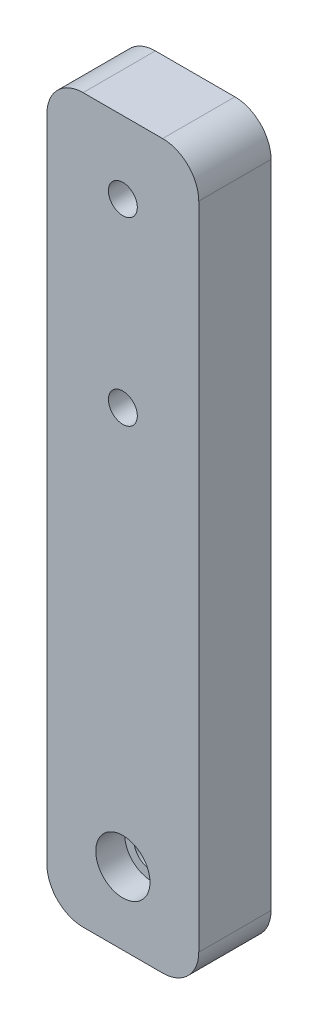
ISO-10303-21;
HEADER;
FILE_DESCRIPTION(('STEP AP214'),'2;1');
FILE_NAME('part.step','',(''),(''),'','','');
FILE_SCHEMA(('AUTOMOTIVE_DESIGN { 1 0 10303 214 1 1 1 1 }'));
ENDSEC;
DATA;
#1=APPLICATION_CONTEXT('core data for automotive mechanical design processes');
#2=APPLICATION_PROTOCOL_DEFINITION('international standard','automotive_design',2000,#1);
#3=PRODUCT_CONTEXT('',#1,'mechanical');
#4=PRODUCT('Part','Part','',(#3));
#5=PRODUCT_RELATED_PRODUCT_CATEGORY('part','',(#4));
#6=PRODUCT_DEFINITION_FORMATION('','',#4);
#7=PRODUCT_DEFINITION_CONTEXT('part definition',#1,'design');
#8=PRODUCT_DEFINITION('design','',#6,#7);
#9=PRODUCT_DEFINITION_SHAPE('','',#8);
#10=(LENGTH_UNIT() NAMED_UNIT(*) SI_UNIT(.MILLI.,.METRE.));
#11=(NAMED_UNIT(*) PLANE_ANGLE_UNIT() SI_UNIT($,.RADIAN.));
#12=(NAMED_UNIT(*) SI_UNIT($,.STERADIAN.) SOLID_ANGLE_UNIT());
#13=UNCERTAINTY_MEASURE_WITH_UNIT(LENGTH_MEASURE(1.E-05),#10,'distance_accuracy_value','');
#14=(GEOMETRIC_REPRESENTATION_CONTEXT(3) GLOBAL_UNCERTAINTY_ASSIGNED_CONTEXT((#13)) GLOBAL_UNIT_ASSIGNED_CONTEXT((#10,
#11,#12)) REPRESENTATION_CONTEXT('',''));
#15=CARTESIAN_POINT('',(0.,0.,0.));
#16=DIRECTION('',(0.,0.,1.));
#17=DIRECTION('',(1.,0.,0.));
#18=AXIS2_PLACEMENT_3D('',#15,#16,#17);
#19=CARTESIAN_POINT('',(2.21719867934379,-80.,0.));
#20=DIRECTION('',(0.,0.,1.));
#21=DIRECTION('',(1.,0.,0.));
#22=AXIS2_PLACEMENT_3D('',#19,#20,#21);
#23=CYLINDRICAL_SURFACE('',#22,2.5);
#24=CARTESIAN_POINT('',(2.21719867934379,-80.,0.));
#25=DIRECTION('',(0.,0.,1.));
#26=DIRECTION('',(1.,0.,0.));
#27=AXIS2_PLACEMENT_3D('',#24,#25,#26);
#28=CIRCLE('',#27,2.5);
#29=CARTESIAN_POINT('',(4.71719867934379,-80.,0.));
#30=VERTEX_POINT('',#29);
#31=EDGE_CURVE('E282',#30,#30,#28,.T.);
#32=ORIENTED_EDGE('',*,*,#31,.F.);
#33=EDGE_LOOP('',(#32));
#34=FACE_BOUND('',#33,.T.);
#35=CARTESIAN_POINT('',(2.21719867934379,-80.,6.));
#36=DIRECTION('',(0.,0.,1.));
#37=DIRECTION('',(1.,0.,0.));
#38=AXIS2_PLACEMENT_3D('',#35,#36,#37);
#39=CIRCLE('',#38,2.5);
#40=CARTESIAN_POINT('',(4.71719867934379,-80.,6.));
#41=VERTEX_POINT('',#40);
#42=EDGE_CURVE('E37',#41,#41,#39,.F.);
#43=ORIENTED_EDGE('',*,*,#42,.F.);
#44=EDGE_LOOP('',(#43));
#45=FACE_BOUND('',#44,.T.);
#46=ADVANCED_FACE('F33',(#34,#45),#23,.F.);
#47=CARTESIAN_POINT('',(2.21719867934379,-25.,0.));
#48=DIRECTION('',(0.,0.,1.));
#49=DIRECTION('',(1.,0.,0.));
#50=AXIS2_PLACEMENT_3D('',#47,#48,#49);
#51=CYLINDRICAL_SURFACE('',#50,2.);
#52=CARTESIAN_POINT('',(2.21719867934379,-25.,10.));
#53=DIRECTION('',(0.,0.,1.));
#54=DIRECTION('',(1.,0.,0.));
#55=AXIS2_PLACEMENT_3D('',#52,#53,#54);
#56=CIRCLE('',#55,2.);
#57=CARTESIAN_POINT('',(4.21719867934379,-25.,10.));
#58=VERTEX_POINT('',#57);
#59=EDGE_CURVE('E278',#58,#58,#56,.T.);
#60=ORIENTED_EDGE('',*,*,#59,.T.);
#61=EDGE_LOOP('',(#60));
#62=FACE_BOUND('',#61,.T.);
#63=CARTESIAN_POINT('',(2.21719867934379,-25.,4.));
#64=DIRECTION('',(0.,0.,-1.));
#65=DIRECTION('',(-1.,0.,0.));
#66=AXIS2_PLACEMENT_3D('',#63,#64,#65);
#67=CIRCLE('',#66,2.);
#68=CARTESIAN_POINT('',(0.217198679343784,-25.,4.));
#69=VERTEX_POINT('',#68);
#70=EDGE_CURVE('E223',#69,#69,#67,.F.);
#71=ORIENTED_EDGE('',*,*,#70,.F.);
#72=EDGE_LOOP('',(#71));
#73=FACE_BOUND('',#72,.T.);
#74=ADVANCED_FACE('F347',(#62,#73),#51,.F.);
#75=CARTESIAN_POINT('',(2.21719867934378,0.,0.));
#76=DIRECTION('',(0.,0.,1.));
#77=DIRECTION('',(1.,0.,0.));
#78=AXIS2_PLACEMENT_3D('',#75,#76,#77);
#79=CYLINDRICAL_SURFACE('',#78,2.);
#80=CARTESIAN_POINT('',(2.21719867934378,0.,10.));
#81=DIRECTION('',(0.,0.,1.));
#82=DIRECTION('',(1.,0.,0.));
#83=AXIS2_PLACEMENT_3D('',#80,#81,#82);
#84=CIRCLE('',#83,2.);
#85=CARTESIAN_POINT('',(4.21719867934378,0.,10.));
#86=VERTEX_POINT('',#85);
#87=EDGE_CURVE('E281',#86,#86,#84,.T.);
#88=ORIENTED_EDGE('',*,*,#87,.T.);
#89=EDGE_LOOP('',(#88));
#90=FACE_BOUND('',#89,.T.);
#91=CARTESIAN_POINT('',(2.21719867934378,0.,4.));
#92=DIRECTION('',(0.,0.,-1.));
#93=DIRECTION('',(-1.,0.,0.));
#94=AXIS2_PLACEMENT_3D('',#91,#92,#93);
#95=CIRCLE('',#94,2.);
#96=CARTESIAN_POINT('',(0.217198679343784,0.,4.));
#97=VERTEX_POINT('',#96);
#98=EDGE_CURVE('E268',#97,#97,#95,.F.);
#99=ORIENTED_EDGE('',*,*,#98,.F.);
#100=EDGE_LOOP('',(#99));
#101=FACE_BOUND('',#100,.T.);
#102=ADVANCED_FACE('F349',(#90,#101),#79,.F.);
#103=CARTESIAN_POINT('',(-8.28280132065621,10.,10.));
#104=DIRECTION('',(1.,0.,0.));
#105=DIRECTION('',(0.,1.,0.));
#106=AXIS2_PLACEMENT_3D('',#103,#104,#105);
#107=PLANE('',#106);
#108=DIRECTION('',(0.,-1.,0.));
#109=VECTOR('',#108,1.);
#110=CARTESIAN_POINT('',(-8.28280132065621,10.,10.));
#111=LINE('',#110,#109);
#112=CARTESIAN_POINT('',(-8.28280132065621,5.,10.));
#113=VERTEX_POINT('',#112);
#114=CARTESIAN_POINT('',(-8.2828013206562,-85.,10.));
#115=VERTEX_POINT('',#114);
#116=EDGE_CURVE('E288',#113,#115,#111,.T.);
#117=ORIENTED_EDGE('',*,*,#116,.F.);
#118=DIRECTION('',(0.,0.,-1.));
#119=VECTOR('',#118,1.);
#120=CARTESIAN_POINT('',(-8.28280132065621,5.,10.));
#121=LINE('',#120,#119);
#122=CARTESIAN_POINT('',(-8.28280132065621,5.,0.));
#123=VERTEX_POINT('',#122);
#124=EDGE_CURVE('E313',#113,#123,#121,.T.);
#125=ORIENTED_EDGE('',*,*,#124,.T.);
#126=DIRECTION('',(0.,-1.,0.));
#127=VECTOR('',#126,1.);
#128=CARTESIAN_POINT('',(-8.28280132065621,10.,0.));
#129=LINE('',#128,#127);
#130=CARTESIAN_POINT('',(-8.2828013206562,-85.,0.));
#131=VERTEX_POINT('',#130);
#132=EDGE_CURVE('E287',#123,#131,#129,.T.);
#133=ORIENTED_EDGE('',*,*,#132,.T.);
#134=DIRECTION('',(0.,0.,-1.));
#135=VECTOR('',#134,1.);
#136=CARTESIAN_POINT('',(-8.2828013206562,-85.,10.));
#137=LINE('',#136,#135);
#138=EDGE_CURVE('E301',#131,#115,#137,.F.);
#139=ORIENTED_EDGE('',*,*,#138,.T.);
#140=EDGE_LOOP('',(#117,#125,#133,#139));
#141=FACE_BOUND('',#140,.T.);
#142=ADVANCED_FACE('F356',(#141),#107,.F.);
#143=CARTESIAN_POINT('',(-8.2828013206562,-90.,10.));
#144=DIRECTION('',(0.,1.,0.));
#145=DIRECTION('',(0.,0.,1.));
#146=AXIS2_PLACEMENT_3D('',#143,#144,#145);
#147=PLANE('',#146);
#148=DIRECTION('',(1.,0.,0.));
#149=VECTOR('',#148,1.);
#150=CARTESIAN_POINT('',(-8.2828013206562,-90.,10.));
#151=LINE('',#150,#149);
#152=CARTESIAN_POINT('',(-3.28280132065621,-90.,10.));
#153=VERTEX_POINT('',#152);
#154=CARTESIAN_POINT('',(7.71719867934379,-90.,10.));
#155=VERTEX_POINT('',#154);
#156=EDGE_CURVE('E291',#153,#155,#151,.T.);
#157=ORIENTED_EDGE('',*,*,#156,.F.);
#158=DIRECTION('',(0.,0.,-1.));
#159=VECTOR('',#158,1.);
#160=CARTESIAN_POINT('',(-3.2828013206562,-90.,10.));
#161=LINE('',#160,#159);
#162=CARTESIAN_POINT('',(-3.28280132065621,-90.,0.));
#163=VERTEX_POINT('',#162);
#164=EDGE_CURVE('E11',#153,#163,#161,.T.);
#165=ORIENTED_EDGE('',*,*,#164,.T.);
#166=DIRECTION('',(1.,0.,0.));
#167=VECTOR('',#166,1.);
#168=CARTESIAN_POINT('',(-8.2828013206562,-90.,0.));
#169=LINE('',#168,#167);
#170=CARTESIAN_POINT('',(7.71719867934379,-90.,0.));
#171=VERTEX_POINT('',#170);
#172=EDGE_CURVE('E304',#163,#171,#169,.T.);
#173=ORIENTED_EDGE('',*,*,#172,.T.);
#174=DIRECTION('',(0.,0.,-1.));
#175=VECTOR('',#174,1.);
#176=CARTESIAN_POINT('',(7.7171986793438,-90.,10.));
#177=LINE('',#176,#175);
#178=EDGE_CURVE('E42',#171,#155,#177,.F.);
#179=ORIENTED_EDGE('',*,*,#178,.T.);
#180=EDGE_LOOP('',(#157,#165,#173,#179));
#181=FACE_BOUND('',#180,.T.);
#182=ADVANCED_FACE('F381',(#181),#147,.F.);
#183=CARTESIAN_POINT('',(12.7171986793438,10.,10.));
#184=DIRECTION('',(-1.,0.,0.));
#185=DIRECTION('',(0.,-1.,0.));
#186=AXIS2_PLACEMENT_3D('',#183,#184,#185);
#187=PLANE('',#186);
#188=DIRECTION('',(0.,1.,0.));
#189=VECTOR('',#188,1.);
#190=CARTESIAN_POINT('',(12.7171986793438,10.,0.));
#191=LINE('',#190,#189);
#192=CARTESIAN_POINT('',(12.7171986793438,-85.,0.));
#193=VERTEX_POINT('',#192);
#194=CARTESIAN_POINT('',(12.7171986793438,5.,0.));
#195=VERTEX_POINT('',#194);
#196=EDGE_CURVE('E307',#193,#195,#191,.T.);
#197=ORIENTED_EDGE('',*,*,#196,.T.);
#198=DIRECTION('',(0.,0.,-1.));
#199=VECTOR('',#198,1.);
#200=CARTESIAN_POINT('',(12.7171986793438,5.,10.));
#201=LINE('',#200,#199);
#202=CARTESIAN_POINT('',(12.7171986793438,5.,10.));
#203=VERTEX_POINT('',#202);
#204=EDGE_CURVE('E340',#195,#203,#201,.F.);
#205=ORIENTED_EDGE('',*,*,#204,.T.);
#206=DIRECTION('',(0.,1.,0.));
#207=VECTOR('',#206,1.);
#208=CARTESIAN_POINT('',(12.7171986793438,10.,10.));
#209=LINE('',#208,#207);
#210=CARTESIAN_POINT('',(12.7171986793438,-85.,10.));
#211=VERTEX_POINT('',#210);
#212=EDGE_CURVE('E295',#211,#203,#209,.T.);
#213=ORIENTED_EDGE('',*,*,#212,.F.);
#214=DIRECTION('',(0.,0.,-1.));
#215=VECTOR('',#214,1.);
#216=CARTESIAN_POINT('',(12.7171986793438,-85.,10.));
#217=LINE('',#216,#215);
#218=EDGE_CURVE('E337',#211,#193,#217,.T.);
#219=ORIENTED_EDGE('',*,*,#218,.T.);
#220=EDGE_LOOP('',(#197,#205,#213,#219));
#221=FACE_BOUND('',#220,.T.);
#222=ADVANCED_FACE('F377',(#221),#187,.F.);
#223=CARTESIAN_POINT('',(-8.28280132065621,10.,10.));
#224=DIRECTION('',(0.,-1.,0.));
#225=DIRECTION('',(0.,0.,-1.));
#226=AXIS2_PLACEMENT_3D('',#223,#224,#225);
#227=PLANE('',#226);
#228=DIRECTION('',(-1.,0.,0.));
#229=VECTOR('',#228,1.);
#230=CARTESIAN_POINT('',(-8.28280132065621,10.,0.));
#231=LINE('',#230,#229);
#232=CARTESIAN_POINT('',(7.71719867934379,10.,0.));
#233=VERTEX_POINT('',#232);
#234=CARTESIAN_POINT('',(-3.28280132065621,10.,0.));
#235=VERTEX_POINT('',#234);
#236=EDGE_CURVE('E292',#233,#235,#231,.T.);
#237=ORIENTED_EDGE('',*,*,#236,.T.);
#238=DIRECTION('',(0.,0.,-1.));
#239=VECTOR('',#238,1.);
#240=CARTESIAN_POINT('',(-3.28280132065621,10.,10.));
#241=LINE('',#240,#239);
#242=CARTESIAN_POINT('',(-3.28280132065621,10.,10.));
#243=VERTEX_POINT('',#242);
#244=EDGE_CURVE('E327',#235,#243,#241,.F.);
#245=ORIENTED_EDGE('',*,*,#244,.T.);
#246=DIRECTION('',(-1.,0.,0.));
#247=VECTOR('',#246,1.);
#248=CARTESIAN_POINT('',(-8.28280132065621,10.,10.));
#249=LINE('',#248,#247);
#250=CARTESIAN_POINT('',(7.71719867934379,10.,10.));
#251=VERTEX_POINT('',#250);
#252=EDGE_CURVE('E298',#251,#243,#249,.T.);
#253=ORIENTED_EDGE('',*,*,#252,.F.);
#254=DIRECTION('',(0.,0.,-1.));
#255=VECTOR('',#254,1.);
#256=CARTESIAN_POINT('',(7.71719867934379,10.,10.));
#257=LINE('',#256,#255);
#258=EDGE_CURVE('E324',#251,#233,#257,.T.);
#259=ORIENTED_EDGE('',*,*,#258,.T.);
#260=EDGE_LOOP('',(#237,#245,#253,#259));
#261=FACE_BOUND('',#260,.T.);
#262=ADVANCED_FACE('F369',(#261),#227,.F.);
#263=CARTESIAN_POINT('',(0.,0.,10.));
#264=DIRECTION('',(0.,0.,1.));
#265=DIRECTION('',(1.,0.,0.));
#266=AXIS2_PLACEMENT_3D('',#263,#264,#265);
#267=PLANE('',#266);
#268=CARTESIAN_POINT('',(2.21719867934379,-80.,10.));
#269=DIRECTION('',(0.,0.,1.));
#270=DIRECTION('',(1.,0.,0.));
#271=AXIS2_PLACEMENT_3D('',#268,#269,#270);
#272=CIRCLE('',#271,3.75);
#273=CARTESIAN_POINT('',(5.96719867934379,-80.,10.));
#274=VERTEX_POINT('',#273);
#275=EDGE_CURVE('E200',#274,#274,#272,.T.);
#276=ORIENTED_EDGE('',*,*,#275,.F.);
#277=EDGE_LOOP('',(#276));
#278=FACE_BOUND('',#277,.T.);
#279=ORIENTED_EDGE('',*,*,#59,.F.);
#280=EDGE_LOOP('',(#279));
#281=FACE_BOUND('',#280,.T.);
#282=ORIENTED_EDGE('',*,*,#87,.F.);
#283=EDGE_LOOP('',(#282));
#284=FACE_BOUND('',#283,.T.);
#285=ORIENTED_EDGE('',*,*,#252,.T.);
#286=CARTESIAN_POINT('',(-3.28280132065621,5.,10.));
#287=DIRECTION('',(0.,0.,1.));
#288=DIRECTION('',(1.,0.,0.));
#289=AXIS2_PLACEMENT_3D('',#286,#287,#288);
#290=CIRCLE('',#289,5.);
#291=EDGE_CURVE('E335',#243,#113,#290,.T.);
#292=ORIENTED_EDGE('',*,*,#291,.T.);
#293=ORIENTED_EDGE('',*,*,#116,.T.);
#294=CARTESIAN_POINT('',(-3.2828013206562,-85.,10.));
#295=DIRECTION('',(0.,0.,1.));
#296=DIRECTION('',(1.,0.,0.));
#297=AXIS2_PLACEMENT_3D('',#294,#295,#296);
#298=CIRCLE('',#297,5.);
#299=EDGE_CURVE('E331',#115,#153,#298,.T.);
#300=ORIENTED_EDGE('',*,*,#299,.T.);
#301=ORIENTED_EDGE('',*,*,#156,.T.);
#302=CARTESIAN_POINT('',(7.7171986793438,-85.,10.));
#303=DIRECTION('',(0.,0.,1.));
#304=DIRECTION('',(1.,0.,0.));
#305=AXIS2_PLACEMENT_3D('',#302,#303,#304);
#306=CIRCLE('',#305,5.);
#307=EDGE_CURVE('E329',#155,#211,#306,.T.);
#308=ORIENTED_EDGE('',*,*,#307,.T.);
#309=ORIENTED_EDGE('',*,*,#212,.T.);
#310=CARTESIAN_POINT('',(7.71719867934379,5.,10.));
#311=DIRECTION('',(0.,0.,1.));
#312=DIRECTION('',(1.,0.,0.));
#313=AXIS2_PLACEMENT_3D('',#310,#311,#312);
#314=CIRCLE('',#313,5.);
#315=EDGE_CURVE('E333',#203,#251,#314,.T.);
#316=ORIENTED_EDGE('',*,*,#315,.T.);
#317=EDGE_LOOP('',(#285,#292,#293,#300,#301,#308,#309,#316));
#318=FACE_BOUND('',#317,.T.);
#319=ADVANCED_FACE('F365',(#278,#281,#284,#318),#267,.T.);
#320=CARTESIAN_POINT('',(0.,0.,0.));
#321=DIRECTION('',(0.,0.,1.));
#322=DIRECTION('',(1.,0.,0.));
#323=AXIS2_PLACEMENT_3D('',#320,#321,#322);
#324=PLANE('',#323);
#325=DIRECTION('',(0.5,-0.866025403784439,0.));
#326=VECTOR('',#325,1.);
#327=CARTESIAN_POINT('',(3.80491191961526,-22.25,0.));
#328=LINE('',#327,#326);
#329=CARTESIAN_POINT('',(3.80491191961526,-22.25,0.));
#330=VERTEX_POINT('',#329);
#331=CARTESIAN_POINT('',(5.39262515988672,-25.,0.));
#332=VERTEX_POINT('',#331);
#333=EDGE_CURVE('E211',#330,#332,#328,.T.);
#334=ORIENTED_EDGE('',*,*,#333,.F.);
#335=DIRECTION('',(1.,0.,0.));
#336=VECTOR('',#335,1.);
#337=CARTESIAN_POINT('',(0.629485439072315,-22.25,0.));
#338=LINE('',#337,#336);
#339=CARTESIAN_POINT('',(0.629485439072315,-22.25,0.));
#340=VERTEX_POINT('',#339);
#341=EDGE_CURVE('E50',#340,#330,#338,.T.);
#342=ORIENTED_EDGE('',*,*,#341,.F.);
#343=DIRECTION('',(0.500000000000001,0.866025403784438,0.));
#344=VECTOR('',#343,1.);
#345=CARTESIAN_POINT('',(-0.958227801199156,-25.,0.));
#346=LINE('',#345,#344);
#347=CARTESIAN_POINT('',(-0.958227801199156,-25.,0.));
#348=VERTEX_POINT('',#347);
#349=EDGE_CURVE('E194',#348,#340,#346,.T.);
#350=ORIENTED_EDGE('',*,*,#349,.F.);
#351=DIRECTION('',(-0.5,0.866025403784438,0.));
#352=VECTOR('',#351,1.);
#353=CARTESIAN_POINT('',(0.629485439072313,-27.75,0.));
#354=LINE('',#353,#352);
#355=CARTESIAN_POINT('',(0.629485439072313,-27.75,0.));
#356=VERTEX_POINT('',#355);
#357=EDGE_CURVE('E197',#356,#348,#354,.T.);
#358=ORIENTED_EDGE('',*,*,#357,.F.);
#359=DIRECTION('',(-1.,0.,0.));
#360=VECTOR('',#359,1.);
#361=CARTESIAN_POINT('',(3.80491191961526,-27.75,0.));
#362=LINE('',#361,#360);
#363=CARTESIAN_POINT('',(3.80491191961526,-27.75,0.));
#364=VERTEX_POINT('',#363);
#365=EDGE_CURVE('E216',#364,#356,#362,.T.);
#366=ORIENTED_EDGE('',*,*,#365,.F.);
#367=DIRECTION('',(-0.5,-0.866025403784439,0.));
#368=VECTOR('',#367,1.);
#369=CARTESIAN_POINT('',(5.39262515988672,-25.,0.));
#370=LINE('',#369,#368);
#371=EDGE_CURVE('E213',#332,#364,#370,.T.);
#372=ORIENTED_EDGE('',*,*,#371,.F.);
#373=EDGE_LOOP('',(#334,#342,#350,#358,#366,#372));
#374=FACE_BOUND('',#373,.T.);
#375=DIRECTION('',(0.5,-0.866025403784439,0.));
#376=VECTOR('',#375,1.);
#377=CARTESIAN_POINT('',(3.80491191961526,2.75,0.));
#378=LINE('',#377,#376);
#379=CARTESIAN_POINT('',(3.80491191961525,2.75,0.));
#380=VERTEX_POINT('',#379);
#381=CARTESIAN_POINT('',(5.39262515988673,0.,0.));
#382=VERTEX_POINT('',#381);
#383=EDGE_CURVE('E252',#380,#382,#378,.T.);
#384=ORIENTED_EDGE('',*,*,#383,.F.);
#385=DIRECTION('',(1.,0.,0.));
#386=VECTOR('',#385,1.);
#387=CARTESIAN_POINT('',(0.629485439072313,2.75,0.));
#388=LINE('',#387,#386);
#389=CARTESIAN_POINT('',(0.629485439072313,2.75,0.));
#390=VERTEX_POINT('',#389);
#391=EDGE_CURVE('E58',#390,#380,#388,.T.);
#392=ORIENTED_EDGE('',*,*,#391,.F.);
#393=DIRECTION('',(0.5,0.866025403784439,0.));
#394=VECTOR('',#393,1.);
#395=CARTESIAN_POINT('',(-0.958227801199158,0.,0.));
#396=LINE('',#395,#394);
#397=CARTESIAN_POINT('',(-0.958227801199158,0.,0.));
#398=VERTEX_POINT('',#397);
#399=EDGE_CURVE('E235',#398,#390,#396,.T.);
#400=ORIENTED_EDGE('',*,*,#399,.F.);
#401=DIRECTION('',(-0.5,0.866025403784439,0.));
#402=VECTOR('',#401,1.);
#403=CARTESIAN_POINT('',(0.629485439072313,-2.75,0.));
#404=LINE('',#403,#402);
#405=CARTESIAN_POINT('',(0.629485439072313,-2.75,0.));
#406=VERTEX_POINT('',#405);
#407=EDGE_CURVE('E261',#406,#398,#404,.T.);
#408=ORIENTED_EDGE('',*,*,#407,.F.);
#409=DIRECTION('',(-1.,0.,0.));
#410=VECTOR('',#409,1.);
#411=CARTESIAN_POINT('',(3.80491191961526,-2.75,0.));
#412=LINE('',#411,#410);
#413=CARTESIAN_POINT('',(3.80491191961526,-2.75,0.));
#414=VERTEX_POINT('',#413);
#415=EDGE_CURVE('E258',#414,#406,#412,.T.);
#416=ORIENTED_EDGE('',*,*,#415,.F.);
#417=DIRECTION('',(-0.5,-0.866025403784439,0.));
#418=VECTOR('',#417,1.);
#419=CARTESIAN_POINT('',(5.39262515988673,0.,0.));
#420=LINE('',#419,#418);
#421=EDGE_CURVE('E255',#382,#414,#420,.T.);
#422=ORIENTED_EDGE('',*,*,#421,.F.);
#423=EDGE_LOOP('',(#384,#392,#400,#408,#416,#422));
#424=FACE_BOUND('',#423,.T.);
#425=ORIENTED_EDGE('',*,*,#31,.T.);
#426=EDGE_LOOP('',(#425));
#427=FACE_BOUND('',#426,.T.);
#428=ORIENTED_EDGE('',*,*,#132,.F.);
#429=CARTESIAN_POINT('',(-3.28280132065621,5.,0.));
#430=DIRECTION('',(0.,0.,1.));
#431=DIRECTION('',(1.,0.,0.));
#432=AXIS2_PLACEMENT_3D('',#429,#430,#431);
#433=CIRCLE('',#432,5.);
#434=EDGE_CURVE('E322',#123,#235,#433,.F.);
#435=ORIENTED_EDGE('',*,*,#434,.T.);
#436=ORIENTED_EDGE('',*,*,#236,.F.);
#437=CARTESIAN_POINT('',(7.71719867934379,5.,0.));
#438=DIRECTION('',(0.,0.,1.));
#439=DIRECTION('',(1.,0.,0.));
#440=AXIS2_PLACEMENT_3D('',#437,#438,#439);
#441=CIRCLE('',#440,5.);
#442=EDGE_CURVE('E320',#233,#195,#441,.F.);
#443=ORIENTED_EDGE('',*,*,#442,.T.);
#444=ORIENTED_EDGE('',*,*,#196,.F.);
#445=CARTESIAN_POINT('',(7.7171986793438,-85.,0.));
#446=DIRECTION('',(0.,0.,1.));
#447=DIRECTION('',(1.,0.,0.));
#448=AXIS2_PLACEMENT_3D('',#445,#446,#447);
#449=CIRCLE('',#448,5.);
#450=EDGE_CURVE('E316',#193,#171,#449,.F.);
#451=ORIENTED_EDGE('',*,*,#450,.T.);
#452=ORIENTED_EDGE('',*,*,#172,.F.);
#453=CARTESIAN_POINT('',(-3.2828013206562,-85.,0.));
#454=DIRECTION('',(0.,0.,1.));
#455=DIRECTION('',(1.,0.,0.));
#456=AXIS2_PLACEMENT_3D('',#453,#454,#455);
#457=CIRCLE('',#456,5.);
#458=EDGE_CURVE('E318',#163,#131,#457,.F.);
#459=ORIENTED_EDGE('',*,*,#458,.T.);
#460=EDGE_LOOP('',(#428,#435,#436,#443,#444,#451,#452,#459));
#461=FACE_BOUND('',#460,.T.);
#462=ADVANCED_FACE('F368',(#374,#424,#427,#461),#324,.F.);
#463=CARTESIAN_POINT('',(-3.28280132065621,5.,10.));
#464=DIRECTION('',(0.,0.,-1.));
#465=DIRECTION('',(-1.,0.,0.));
#466=AXIS2_PLACEMENT_3D('',#463,#464,#465);
#467=CYLINDRICAL_SURFACE('',#466,5.);
#468=ORIENTED_EDGE('',*,*,#291,.F.);
#469=ORIENTED_EDGE('',*,*,#244,.F.);
#470=ORIENTED_EDGE('',*,*,#434,.F.);
#471=ORIENTED_EDGE('',*,*,#124,.F.);
#472=EDGE_LOOP('',(#468,#469,#470,#471));
#473=FACE_BOUND('',#472,.T.);
#474=ADVANCED_FACE('F373',(#473),#467,.T.);
#475=CARTESIAN_POINT('',(7.71719867934379,5.,10.));
#476=DIRECTION('',(0.,0.,-1.));
#477=DIRECTION('',(-1.,0.,0.));
#478=AXIS2_PLACEMENT_3D('',#475,#476,#477);
#479=CYLINDRICAL_SURFACE('',#478,5.);
#480=ORIENTED_EDGE('',*,*,#315,.F.);
#481=ORIENTED_EDGE('',*,*,#204,.F.);
#482=ORIENTED_EDGE('',*,*,#442,.F.);
#483=ORIENTED_EDGE('',*,*,#258,.F.);
#484=EDGE_LOOP('',(#480,#481,#482,#483));
#485=FACE_BOUND('',#484,.T.);
#486=ADVANCED_FACE('F391',(#485),#479,.T.);
#487=CARTESIAN_POINT('',(-3.2828013206562,-85.,10.));
#488=DIRECTION('',(0.,0.,-1.));
#489=DIRECTION('',(-1.,0.,0.));
#490=AXIS2_PLACEMENT_3D('',#487,#488,#489);
#491=CYLINDRICAL_SURFACE('',#490,5.);
#492=ORIENTED_EDGE('',*,*,#299,.F.);
#493=ORIENTED_EDGE('',*,*,#138,.F.);
#494=ORIENTED_EDGE('',*,*,#458,.F.);
#495=ORIENTED_EDGE('',*,*,#164,.F.);
#496=EDGE_LOOP('',(#492,#493,#494,#495));
#497=FACE_BOUND('',#496,.T.);
#498=ADVANCED_FACE('F394',(#497),#491,.T.);
#499=CARTESIAN_POINT('',(7.7171986793438,-85.,10.));
#500=DIRECTION('',(0.,0.,-1.));
#501=DIRECTION('',(-1.,0.,0.));
#502=AXIS2_PLACEMENT_3D('',#499,#500,#501);
#503=CYLINDRICAL_SURFACE('',#502,5.);
#504=ORIENTED_EDGE('',*,*,#307,.F.);
#505=ORIENTED_EDGE('',*,*,#178,.F.);
#506=ORIENTED_EDGE('',*,*,#450,.F.);
#507=ORIENTED_EDGE('',*,*,#218,.F.);
#508=EDGE_LOOP('',(#504,#505,#506,#507));
#509=FACE_BOUND('',#508,.T.);
#510=ADVANCED_FACE('F35',(#509),#503,.T.);
#511=CARTESIAN_POINT('',(0.,0.,4.));
#512=DIRECTION('',(0.,0.,-1.));
#513=DIRECTION('',(-1.,0.,0.));
#514=AXIS2_PLACEMENT_3D('',#511,#512,#513);
#515=PLANE('',#514);
#516=DIRECTION('',(1.,0.,0.));
#517=VECTOR('',#516,1.);
#518=CARTESIAN_POINT('',(0.629485439072313,2.75,4.));
#519=LINE('',#518,#517);
#520=CARTESIAN_POINT('',(0.629485439072313,2.75,4.));
#521=VERTEX_POINT('',#520);
#522=CARTESIAN_POINT('',(3.80491191961526,2.75,4.));
#523=VERTEX_POINT('',#522);
#524=EDGE_CURVE('E231',#521,#523,#519,.T.);
#525=ORIENTED_EDGE('',*,*,#524,.T.);
#526=DIRECTION('',(0.5,-0.866025403784439,0.));
#527=VECTOR('',#526,1.);
#528=CARTESIAN_POINT('',(3.80491191961526,2.75,4.));
#529=LINE('',#528,#527);
#530=CARTESIAN_POINT('',(5.39262515988673,0.,4.));
#531=VERTEX_POINT('',#530);
#532=EDGE_CURVE('E234',#523,#531,#529,.T.);
#533=ORIENTED_EDGE('',*,*,#532,.T.);
#534=DIRECTION('',(-0.5,-0.866025403784439,0.));
#535=VECTOR('',#534,1.);
#536=CARTESIAN_POINT('',(5.39262515988673,0.,4.));
#537=LINE('',#536,#535);
#538=CARTESIAN_POINT('',(3.80491191961526,-2.75,4.));
#539=VERTEX_POINT('',#538);
#540=EDGE_CURVE('E238',#531,#539,#537,.T.);
#541=ORIENTED_EDGE('',*,*,#540,.T.);
#542=DIRECTION('',(-1.,0.,0.));
#543=VECTOR('',#542,1.);
#544=CARTESIAN_POINT('',(3.80491191961526,-2.75,4.));
#545=LINE('',#544,#543);
#546=CARTESIAN_POINT('',(0.629485439072313,-2.75,4.));
#547=VERTEX_POINT('',#546);
#548=EDGE_CURVE('E241',#539,#547,#545,.T.);
#549=ORIENTED_EDGE('',*,*,#548,.T.);
#550=DIRECTION('',(-0.5,0.866025403784439,0.));
#551=VECTOR('',#550,1.);
#552=CARTESIAN_POINT('',(0.629485439072313,-2.75,4.));
#553=LINE('',#552,#551);
#554=CARTESIAN_POINT('',(-0.958227801199158,0.,4.));
#555=VERTEX_POINT('',#554);
#556=EDGE_CURVE('E244',#547,#555,#553,.T.);
#557=ORIENTED_EDGE('',*,*,#556,.T.);
#558=DIRECTION('',(0.5,0.866025403784439,0.));
#559=VECTOR('',#558,1.);
#560=CARTESIAN_POINT('',(-0.958227801199158,0.,4.));
#561=LINE('',#560,#559);
#562=EDGE_CURVE('E247',#555,#521,#561,.T.);
#563=ORIENTED_EDGE('',*,*,#562,.T.);
#564=EDGE_LOOP('',(#525,#533,#541,#549,#557,#563));
#565=FACE_BOUND('',#564,.T.);
#566=ORIENTED_EDGE('',*,*,#98,.T.);
#567=EDGE_LOOP('',(#566));
#568=FACE_BOUND('',#567,.T.);
#569=ADVANCED_FACE('F401',(#565,#568),#515,.T.);
#570=CARTESIAN_POINT('',(0.629485439072313,2.75,4.));
#571=DIRECTION('',(0.,1.,0.));
#572=DIRECTION('',(-1.,0.,0.));
#573=AXIS2_PLACEMENT_3D('',#570,#571,#572);
#574=PLANE('',#573);
#575=ORIENTED_EDGE('',*,*,#391,.T.);
#576=DIRECTION('',(0.,0.,-1.));
#577=VECTOR('',#576,1.);
#578=CARTESIAN_POINT('',(3.80491191961526,2.75,4.));
#579=LINE('',#578,#577);
#580=EDGE_CURVE('E250',#523,#380,#579,.T.);
#581=ORIENTED_EDGE('',*,*,#580,.F.);
#582=ORIENTED_EDGE('',*,*,#524,.F.);
#583=DIRECTION('',(0.,0.,-1.));
#584=VECTOR('',#583,1.);
#585=CARTESIAN_POINT('',(0.629485439072313,2.75,4.));
#586=LINE('',#585,#584);
#587=EDGE_CURVE('E266',#521,#390,#586,.T.);
#588=ORIENTED_EDGE('',*,*,#587,.T.);
#589=EDGE_LOOP('',(#575,#581,#582,#588));
#590=FACE_BOUND('',#589,.T.);
#591=ADVANCED_FACE('F362',(#590),#574,.F.);
#592=CARTESIAN_POINT('',(-0.958227801199158,0.,4.));
#593=DIRECTION('',(-0.866025403784439,0.5,0.));
#594=DIRECTION('',(-0.5,-0.866025403784439,0.));
#595=AXIS2_PLACEMENT_3D('',#592,#593,#594);
#596=PLANE('',#595);
#597=ORIENTED_EDGE('',*,*,#399,.T.);
#598=ORIENTED_EDGE('',*,*,#587,.F.);
#599=ORIENTED_EDGE('',*,*,#562,.F.);
#600=DIRECTION('',(0.,0.,-1.));
#601=VECTOR('',#600,1.);
#602=CARTESIAN_POINT('',(-0.958227801199158,0.,4.));
#603=LINE('',#602,#601);
#604=EDGE_CURVE('E269',#555,#398,#603,.T.);
#605=ORIENTED_EDGE('',*,*,#604,.T.);
#606=EDGE_LOOP('',(#597,#598,#599,#605));
#607=FACE_BOUND('',#606,.T.);
#608=ADVANCED_FACE('F433',(#607),#596,.F.);
#609=CARTESIAN_POINT('',(0.629485439072313,-2.75,4.));
#610=DIRECTION('',(-0.866025403784439,-0.5,0.));
#611=DIRECTION('',(0.5,-0.866025403784439,0.));
#612=AXIS2_PLACEMENT_3D('',#609,#610,#611);
#613=PLANE('',#612);
#614=ORIENTED_EDGE('',*,*,#407,.T.);
#615=ORIENTED_EDGE('',*,*,#604,.F.);
#616=ORIENTED_EDGE('',*,*,#556,.F.);
#617=DIRECTION('',(0.,0.,-1.));
#618=VECTOR('',#617,1.);
#619=CARTESIAN_POINT('',(0.629485439072313,-2.75,4.));
#620=LINE('',#619,#618);
#621=EDGE_CURVE('E271',#547,#406,#620,.T.);
#622=ORIENTED_EDGE('',*,*,#621,.T.);
#623=EDGE_LOOP('',(#614,#615,#616,#622));
#624=FACE_BOUND('',#623,.T.);
#625=ADVANCED_FACE('F440',(#624),#613,.F.);
#626=CARTESIAN_POINT('',(3.80491191961526,-2.75,4.));
#627=DIRECTION('',(0.,-1.,0.));
#628=DIRECTION('',(0.,0.,-1.));
#629=AXIS2_PLACEMENT_3D('',#626,#627,#628);
#630=PLANE('',#629);
#631=ORIENTED_EDGE('',*,*,#415,.T.);
#632=ORIENTED_EDGE('',*,*,#621,.F.);
#633=ORIENTED_EDGE('',*,*,#548,.F.);
#634=DIRECTION('',(0.,0.,-1.));
#635=VECTOR('',#634,1.);
#636=CARTESIAN_POINT('',(3.80491191961526,-2.75,4.));
#637=LINE('',#636,#635);
#638=EDGE_CURVE('E273',#539,#414,#637,.T.);
#639=ORIENTED_EDGE('',*,*,#638,.T.);
#640=EDGE_LOOP('',(#631,#632,#633,#639));
#641=FACE_BOUND('',#640,.T.);
#642=ADVANCED_FACE('F444',(#641),#630,.F.);
#643=CARTESIAN_POINT('',(5.39262515988673,0.,4.));
#644=DIRECTION('',(0.866025403784439,-0.5,0.));
#645=DIRECTION('',(0.5,0.866025403784439,0.));
#646=AXIS2_PLACEMENT_3D('',#643,#644,#645);
#647=PLANE('',#646);
#648=ORIENTED_EDGE('',*,*,#421,.T.);
#649=ORIENTED_EDGE('',*,*,#638,.F.);
#650=ORIENTED_EDGE('',*,*,#540,.F.);
#651=DIRECTION('',(0.,0.,-1.));
#652=VECTOR('',#651,1.);
#653=CARTESIAN_POINT('',(5.39262515988673,0.,4.));
#654=LINE('',#653,#652);
#655=EDGE_CURVE('E275',#531,#382,#654,.T.);
#656=ORIENTED_EDGE('',*,*,#655,.T.);
#657=EDGE_LOOP('',(#648,#649,#650,#656));
#658=FACE_BOUND('',#657,.T.);
#659=ADVANCED_FACE('F448',(#658),#647,.F.);
#660=CARTESIAN_POINT('',(3.80491191961526,2.75,4.));
#661=DIRECTION('',(0.866025403784439,0.5,0.));
#662=DIRECTION('',(-0.5,0.866025403784439,0.));
#663=AXIS2_PLACEMENT_3D('',#660,#661,#662);
#664=PLANE('',#663);
#665=ORIENTED_EDGE('',*,*,#383,.T.);
#666=ORIENTED_EDGE('',*,*,#655,.F.);
#667=ORIENTED_EDGE('',*,*,#532,.F.);
#668=ORIENTED_EDGE('',*,*,#580,.T.);
#669=EDGE_LOOP('',(#665,#666,#667,#668));
#670=FACE_BOUND('',#669,.T.);
#671=ADVANCED_FACE('F451',(#670),#664,.F.);
#672=CARTESIAN_POINT('',(0.,0.,4.));
#673=DIRECTION('',(0.,0.,-1.));
#674=DIRECTION('',(-1.,0.,0.));
#675=AXIS2_PLACEMENT_3D('',#672,#673,#674);
#676=PLANE('',#675);
#677=DIRECTION('',(1.,0.,0.));
#678=VECTOR('',#677,1.);
#679=CARTESIAN_POINT('',(0.629485439072315,-22.25,4.));
#680=LINE('',#679,#678);
#681=CARTESIAN_POINT('',(0.629485439072315,-22.25,4.));
#682=VERTEX_POINT('',#681);
#683=CARTESIAN_POINT('',(3.80491191961526,-22.25,4.));
#684=VERTEX_POINT('',#683);
#685=EDGE_CURVE('E174',#682,#684,#680,.T.);
#686=ORIENTED_EDGE('',*,*,#685,.T.);
#687=DIRECTION('',(0.5,-0.866025403784439,0.));
#688=VECTOR('',#687,1.);
#689=CARTESIAN_POINT('',(3.80491191961526,-22.25,4.));
#690=LINE('',#689,#688);
#691=CARTESIAN_POINT('',(5.39262515988672,-25.,4.));
#692=VERTEX_POINT('',#691);
#693=EDGE_CURVE('E183',#684,#692,#690,.T.);
#694=ORIENTED_EDGE('',*,*,#693,.T.);
#695=DIRECTION('',(-0.5,-0.866025403784439,0.));
#696=VECTOR('',#695,1.);
#697=CARTESIAN_POINT('',(5.39262515988672,-25.,4.));
#698=LINE('',#697,#696);
#699=CARTESIAN_POINT('',(3.80491191961526,-27.75,4.));
#700=VERTEX_POINT('',#699);
#701=EDGE_CURVE('E188',#692,#700,#698,.T.);
#702=ORIENTED_EDGE('',*,*,#701,.T.);
#703=DIRECTION('',(-1.,0.,0.));
#704=VECTOR('',#703,1.);
#705=CARTESIAN_POINT('',(3.80491191961526,-27.75,4.));
#706=LINE('',#705,#704);
#707=CARTESIAN_POINT('',(0.629485439072313,-27.75,4.));
#708=VERTEX_POINT('',#707);
#709=EDGE_CURVE('E204',#700,#708,#706,.T.);
#710=ORIENTED_EDGE('',*,*,#709,.T.);
#711=DIRECTION('',(-0.5,0.866025403784438,0.));
#712=VECTOR('',#711,1.);
#713=CARTESIAN_POINT('',(0.629485439072313,-27.75,4.));
#714=LINE('',#713,#712);
#715=CARTESIAN_POINT('',(-0.958227801199156,-25.,4.));
#716=VERTEX_POINT('',#715);
#717=EDGE_CURVE('E207',#708,#716,#714,.T.);
#718=ORIENTED_EDGE('',*,*,#717,.T.);
#719=DIRECTION('',(0.500000000000001,0.866025403784438,0.));
#720=VECTOR('',#719,1.);
#721=CARTESIAN_POINT('',(-0.958227801199156,-25.,4.));
#722=LINE('',#721,#720);
#723=EDGE_CURVE('E180',#716,#682,#722,.T.);
#724=ORIENTED_EDGE('',*,*,#723,.T.);
#725=EDGE_LOOP('',(#686,#694,#702,#710,#718,#724));
#726=FACE_BOUND('',#725,.T.);
#727=ORIENTED_EDGE('',*,*,#70,.T.);
#728=EDGE_LOOP('',(#727));
#729=FACE_BOUND('',#728,.T.);
#730=ADVANCED_FACE('F190',(#726,#729),#676,.T.);
#731=CARTESIAN_POINT('',(0.629485439072315,-22.25,4.));
#732=DIRECTION('',(0.,1.,0.));
#733=DIRECTION('',(0.,0.,1.));
#734=AXIS2_PLACEMENT_3D('',#731,#732,#733);
#735=PLANE('',#734);
#736=ORIENTED_EDGE('',*,*,#341,.T.);
#737=DIRECTION('',(0.,0.,-1.));
#738=VECTOR('',#737,1.);
#739=CARTESIAN_POINT('',(3.80491191961526,-22.25,4.));
#740=LINE('',#739,#738);
#741=EDGE_CURVE('E170',#684,#330,#740,.T.);
#742=ORIENTED_EDGE('',*,*,#741,.F.);
#743=ORIENTED_EDGE('',*,*,#685,.F.);
#744=DIRECTION('',(0.,0.,-1.));
#745=VECTOR('',#744,1.);
#746=CARTESIAN_POINT('',(0.629485439072315,-22.25,4.));
#747=LINE('',#746,#745);
#748=EDGE_CURVE('E221',#682,#340,#747,.T.);
#749=ORIENTED_EDGE('',*,*,#748,.T.);
#750=EDGE_LOOP('',(#736,#742,#743,#749));
#751=FACE_BOUND('',#750,.T.);
#752=ADVANCED_FACE('F172',(#751),#735,.F.);
#753=CARTESIAN_POINT('',(-0.958227801199156,-25.,4.));
#754=DIRECTION('',(-0.866025403784438,0.500000000000001,0.));
#755=DIRECTION('',(-0.500000000000001,-0.866025403784438,0.));
#756=AXIS2_PLACEMENT_3D('',#753,#754,#755);
#757=PLANE('',#756);
#758=ORIENTED_EDGE('',*,*,#349,.T.);
#759=ORIENTED_EDGE('',*,*,#748,.F.);
#760=ORIENTED_EDGE('',*,*,#723,.F.);
#761=DIRECTION('',(0.,0.,-1.));
#762=VECTOR('',#761,1.);
#763=CARTESIAN_POINT('',(-0.958227801199156,-25.,4.));
#764=LINE('',#763,#762);
#765=EDGE_CURVE('E224',#716,#348,#764,.T.);
#766=ORIENTED_EDGE('',*,*,#765,.T.);
#767=EDGE_LOOP('',(#758,#759,#760,#766));
#768=FACE_BOUND('',#767,.T.);
#769=ADVANCED_FACE('F500',(#768),#757,.F.);
#770=CARTESIAN_POINT('',(0.629485439072313,-27.75,4.));
#771=DIRECTION('',(-0.866025403784439,-0.5,0.));
#772=DIRECTION('',(0.5,-0.866025403784439,0.));
#773=AXIS2_PLACEMENT_3D('',#770,#771,#772);
#774=PLANE('',#773);
#775=ORIENTED_EDGE('',*,*,#357,.T.);
#776=ORIENTED_EDGE('',*,*,#765,.F.);
#777=ORIENTED_EDGE('',*,*,#717,.F.);
#778=DIRECTION('',(0.,0.,-1.));
#779=VECTOR('',#778,1.);
#780=CARTESIAN_POINT('',(0.629485439072313,-27.75,4.));
#781=LINE('',#780,#779);
#782=EDGE_CURVE('E226',#708,#356,#781,.T.);
#783=ORIENTED_EDGE('',*,*,#782,.T.);
#784=EDGE_LOOP('',(#775,#776,#777,#783));
#785=FACE_BOUND('',#784,.T.);
#786=ADVANCED_FACE('F503',(#785),#774,.F.);
#787=CARTESIAN_POINT('',(3.80491191961526,-27.75,4.));
#788=DIRECTION('',(0.,-1.,0.));
#789=DIRECTION('',(0.,0.,-1.));
#790=AXIS2_PLACEMENT_3D('',#787,#788,#789);
#791=PLANE('',#790);
#792=ORIENTED_EDGE('',*,*,#365,.T.);
#793=ORIENTED_EDGE('',*,*,#782,.F.);
#794=ORIENTED_EDGE('',*,*,#709,.F.);
#795=DIRECTION('',(0.,0.,-1.));
#796=VECTOR('',#795,1.);
#797=CARTESIAN_POINT('',(3.80491191961526,-27.75,4.));
#798=LINE('',#797,#796);
#799=EDGE_CURVE('E228',#700,#364,#798,.T.);
#800=ORIENTED_EDGE('',*,*,#799,.T.);
#801=EDGE_LOOP('',(#792,#793,#794,#800));
#802=FACE_BOUND('',#801,.T.);
#803=ADVANCED_FACE('F507',(#802),#791,.F.);
#804=CARTESIAN_POINT('',(5.39262515988672,-25.,4.));
#805=DIRECTION('',(0.866025403784439,-0.5,0.));
#806=DIRECTION('',(0.5,0.866025403784439,0.));
#807=AXIS2_PLACEMENT_3D('',#804,#805,#806);
#808=PLANE('',#807);
#809=ORIENTED_EDGE('',*,*,#371,.T.);
#810=ORIENTED_EDGE('',*,*,#799,.F.);
#811=ORIENTED_EDGE('',*,*,#701,.F.);
#812=DIRECTION('',(0.,0.,-1.));
#813=VECTOR('',#812,1.);
#814=CARTESIAN_POINT('',(5.39262515988672,-25.,4.));
#815=LINE('',#814,#813);
#816=EDGE_CURVE('E179',#692,#332,#815,.T.);
#817=ORIENTED_EDGE('',*,*,#816,.T.);
#818=EDGE_LOOP('',(#809,#810,#811,#817));
#819=FACE_BOUND('',#818,.T.);
#820=ADVANCED_FACE('F511',(#819),#808,.F.);
#821=CARTESIAN_POINT('',(3.80491191961526,-22.25,4.));
#822=DIRECTION('',(0.866025403784439,0.5,0.));
#823=DIRECTION('',(-0.5,0.866025403784439,0.));
#824=AXIS2_PLACEMENT_3D('',#821,#822,#823);
#825=PLANE('',#824);
#826=ORIENTED_EDGE('',*,*,#333,.T.);
#827=ORIENTED_EDGE('',*,*,#816,.F.);
#828=ORIENTED_EDGE('',*,*,#693,.F.);
#829=ORIENTED_EDGE('',*,*,#741,.T.);
#830=EDGE_LOOP('',(#826,#827,#828,#829));
#831=FACE_BOUND('',#830,.T.);
#832=ADVANCED_FACE('F184',(#831),#825,.F.);
#833=CARTESIAN_POINT('',(2.21719867934379,-80.,6.));
#834=DIRECTION('',(0.,0.,1.));
#835=DIRECTION('',(1.,0.,0.));
#836=AXIS2_PLACEMENT_3D('',#833,#834,#835);
#837=PLANE('',#836);
#838=CARTESIAN_POINT('',(2.21719867934379,-80.,6.));
#839=DIRECTION('',(0.,0.,1.));
#840=DIRECTION('',(1.,0.,0.));
#841=AXIS2_PLACEMENT_3D('',#838,#839,#840);
#842=CIRCLE('',#841,3.75);
#843=CARTESIAN_POINT('',(5.96719867934379,-80.,6.));
#844=VERTEX_POINT('',#843);
#845=EDGE_CURVE('E477',#844,#844,#842,.T.);
#846=ORIENTED_EDGE('',*,*,#845,.T.);
#847=EDGE_LOOP('',(#846));
#848=FACE_BOUND('',#847,.T.);
#849=ORIENTED_EDGE('',*,*,#42,.T.);
#850=EDGE_LOOP('',(#849));
#851=FACE_BOUND('',#850,.T.);
#852=ADVANCED_FACE('F492',(#848,#851),#837,.T.);
#853=CARTESIAN_POINT('',(2.21719867934379,-80.,6.));
#854=DIRECTION('',(0.,0.,1.));
#855=DIRECTION('',(1.,0.,0.));
#856=AXIS2_PLACEMENT_3D('',#853,#854,#855);
#857=CYLINDRICAL_SURFACE('',#856,3.75);
#858=ORIENTED_EDGE('',*,*,#845,.F.);
#859=EDGE_LOOP('',(#858));
#860=FACE_BOUND('',#859,.T.);
#861=ORIENTED_EDGE('',*,*,#275,.T.);
#862=EDGE_LOOP('',(#861));
#863=FACE_BOUND('',#862,.T.);
#864=ADVANCED_FACE('F484',(#860,#863),#857,.F.);
#865=CLOSED_SHELL('',(#46,#74,#102,#142,#182,#222,#262,#319,#462,#474,#486,#498,#510,#569,#591,
#608,#625,#642,#659,#671,#730,#752,#769,#786,#803,#820,#832,#852,#864));
#866=MANIFOLD_SOLID_BREP('B2',#865);
#867=ADVANCED_BREP_SHAPE_REPRESENTATION('',(#18,#866),#14);
#868=SHAPE_DEFINITION_REPRESENTATION(#9,#867);
ENDSEC;
END-ISO-10303-21;
